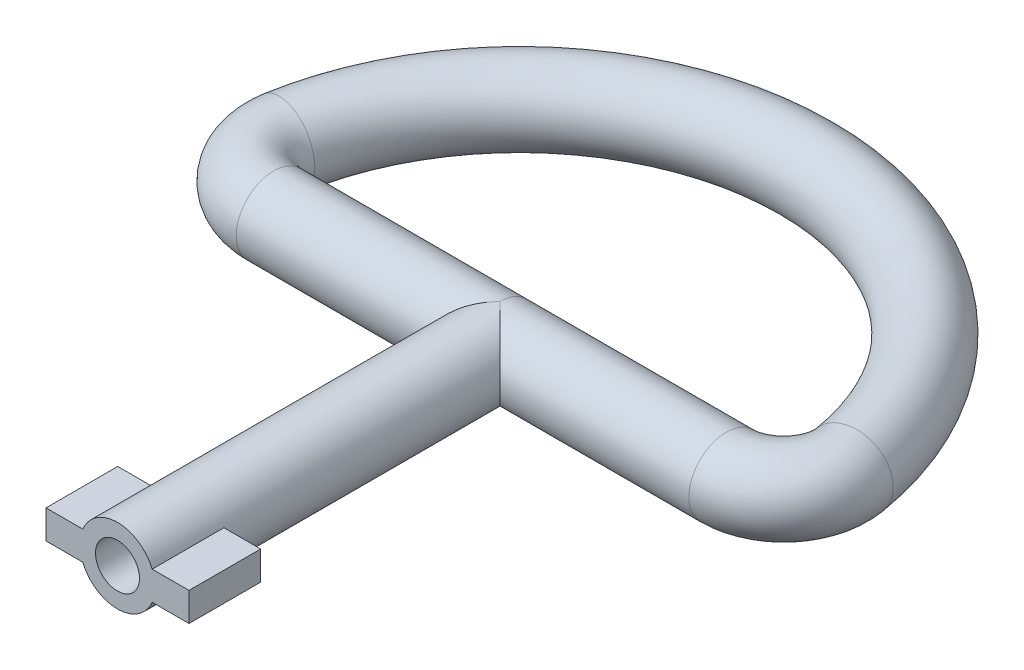
ISO-10303-21;
HEADER;
FILE_DESCRIPTION(('STEP AP214'),'2;1');
FILE_NAME('part.step','',(''),(''),'','','');
FILE_SCHEMA(('AUTOMOTIVE_DESIGN { 1 0 10303 214 1 1 1 1 }'));
ENDSEC;
DATA;
#1=APPLICATION_CONTEXT('core data for automotive mechanical design processes');
#2=APPLICATION_PROTOCOL_DEFINITION('international standard','automotive_design',2000,#1);
#3=PRODUCT_CONTEXT('',#1,'mechanical');
#4=PRODUCT('Part','Part','',(#3));
#5=PRODUCT_RELATED_PRODUCT_CATEGORY('part','',(#4));
#6=PRODUCT_DEFINITION_FORMATION('','',#4);
#7=PRODUCT_DEFINITION_CONTEXT('part definition',#1,'design');
#8=PRODUCT_DEFINITION('design','',#6,#7);
#9=PRODUCT_DEFINITION_SHAPE('','',#8);
#10=(LENGTH_UNIT() NAMED_UNIT(*) SI_UNIT(.MILLI.,.METRE.));
#11=(NAMED_UNIT(*) PLANE_ANGLE_UNIT() SI_UNIT($,.RADIAN.));
#12=(NAMED_UNIT(*) SI_UNIT($,.STERADIAN.) SOLID_ANGLE_UNIT());
#13=UNCERTAINTY_MEASURE_WITH_UNIT(LENGTH_MEASURE(1.E-05),#10,'distance_accuracy_value','');
#14=(GEOMETRIC_REPRESENTATION_CONTEXT(3) GLOBAL_UNCERTAINTY_ASSIGNED_CONTEXT((#13)) GLOBAL_UNIT_ASSIGNED_CONTEXT((#10,
#11,#12)) REPRESENTATION_CONTEXT('',''));
#15=CARTESIAN_POINT('',(0.,0.,0.));
#16=DIRECTION('',(0.,0.,1.));
#17=DIRECTION('',(1.,0.,0.));
#18=AXIS2_PLACEMENT_3D('',#15,#16,#17);
#19=CARTESIAN_POINT('',(0.,0.,-7.5));
#20=DIRECTION('',(0.,0.,1.));
#21=DIRECTION('',(1.,0.,0.));
#22=AXIS2_PLACEMENT_3D('',#19,#20,#21);
#23=CYLINDRICAL_SURFACE('',#22,3.925);
#24=CARTESIAN_POINT('',(0.,0.,0.));
#25=DIRECTION('',(0.,0.,1.));
#26=DIRECTION('',(1.,0.,0.));
#27=AXIS2_PLACEMENT_3D('',#24,#25,#26);
#28=CIRCLE('',#27,3.925);
#29=CARTESIAN_POINT('',(-3.62706837542388,-1.5,0.));
#30=VERTEX_POINT('',#29);
#31=CARTESIAN_POINT('',(3.62706837542388,-1.5,0.));
#32=VERTEX_POINT('',#31);
#33=EDGE_CURVE('E172',#30,#32,#28,.T.);
#34=ORIENTED_EDGE('',*,*,#33,.F.);
#35=DIRECTION('',(0.,0.,1.));
#36=VECTOR('',#35,1.);
#37=CARTESIAN_POINT('',(-3.62706837542388,-1.5,-7.5));
#38=LINE('',#37,#36);
#39=CARTESIAN_POINT('',(-3.62706837542388,-1.5,-7.5));
#40=VERTEX_POINT('',#39);
#41=EDGE_CURVE('E192',#40,#30,#38,.T.);
#42=ORIENTED_EDGE('',*,*,#41,.F.);
#43=CARTESIAN_POINT('',(0.,0.,-7.5));
#44=DIRECTION('',(0.,0.,-1.));
#45=DIRECTION('',(-1.,0.,0.));
#46=AXIS2_PLACEMENT_3D('',#43,#44,#45);
#47=CIRCLE('',#46,3.925);
#48=CARTESIAN_POINT('',(-3.62706837542388,1.5,-7.5));
#49=VERTEX_POINT('',#48);
#50=EDGE_CURVE('E52',#40,#49,#47,.T.);
#51=ORIENTED_EDGE('',*,*,#50,.T.);
#52=DIRECTION('',(0.,0.,1.));
#53=VECTOR('',#52,1.);
#54=CARTESIAN_POINT('',(-3.62706837542388,1.5,-7.5));
#55=LINE('',#54,#53);
#56=CARTESIAN_POINT('',(-3.62706837542388,1.5,0.));
#57=VERTEX_POINT('',#56);
#58=EDGE_CURVE('E46',#49,#57,#55,.T.);
#59=ORIENTED_EDGE('',*,*,#58,.T.);
#60=CARTESIAN_POINT('',(0.,0.,0.));
#61=DIRECTION('',(0.,0.,1.));
#62=DIRECTION('',(1.,0.,0.));
#63=AXIS2_PLACEMENT_3D('',#60,#61,#62);
#64=CIRCLE('',#63,3.925);
#65=CARTESIAN_POINT('',(3.62706837542388,1.5,0.));
#66=VERTEX_POINT('',#65);
#67=EDGE_CURVE('E155',#66,#57,#64,.T.);
#68=ORIENTED_EDGE('',*,*,#67,.F.);
#69=DIRECTION('',(0.,0.,1.));
#70=VECTOR('',#69,1.);
#71=CARTESIAN_POINT('',(3.62706837542388,1.5,-7.5));
#72=LINE('',#71,#70);
#73=CARTESIAN_POINT('',(3.62706837542388,1.5,-7.5));
#74=VERTEX_POINT('',#73);
#75=EDGE_CURVE('E100',#74,#66,#72,.T.);
#76=ORIENTED_EDGE('',*,*,#75,.F.);
#77=CARTESIAN_POINT('',(3.62706837542388,-1.5,-7.5));
#78=VERTEX_POINT('',#77);
#79=EDGE_CURVE('E11',#74,#78,#47,.T.);
#80=ORIENTED_EDGE('',*,*,#79,.T.);
#81=DIRECTION('',(0.,0.,1.));
#82=VECTOR('',#81,1.);
#83=CARTESIAN_POINT('',(3.62706837542388,-1.5,-7.5));
#84=LINE('',#83,#82);
#85=EDGE_CURVE('E136',#78,#32,#84,.T.);
#86=ORIENTED_EDGE('',*,*,#85,.T.);
#87=EDGE_LOOP('',(#34,#42,#51,#59,#68,#76,#80,#86));
#88=FACE_BOUND('',#87,.T.);
#89=CARTESIAN_POINT('',(0.,0.,-40.));
#90=DIRECTION('',(-0.707106781186547,0.,0.707106781186547));
#91=DIRECTION('',(0.707106781186547,0.,0.707106781186547));
#92=AXIS2_PLACEMENT_3D('',#89,#90,#91);
#93=ELLIPSE('',#92,5.55078823231439,3.925);
#94=CARTESIAN_POINT('',(0.,-3.925,-40.));
#95=VERTEX_POINT('',#94);
#96=CARTESIAN_POINT('',(0.,3.925,-40.));
#97=VERTEX_POINT('',#96);
#98=EDGE_CURVE('E254',#95,#97,#93,.T.);
#99=ORIENTED_EDGE('',*,*,#98,.T.);
#100=CARTESIAN_POINT('',(0.,0.,-40.));
#101=DIRECTION('',(0.707106781186547,0.,0.707106781186547));
#102=DIRECTION('',(-0.707106781186547,0.,0.707106781186547));
#103=AXIS2_PLACEMENT_3D('',#100,#101,#102);
#104=ELLIPSE('',#103,5.55078823231439,3.925);
#105=EDGE_CURVE('E247',#97,#95,#104,.T.);
#106=ORIENTED_EDGE('',*,*,#105,.T.);
#107=EDGE_LOOP('',(#99,#106));
#108=FACE_BOUND('',#107,.T.);
#109=ADVANCED_FACE('F42',(#88,#108),#23,.T.);
#110=CARTESIAN_POINT('',(0.,0.,-7.5));
#111=DIRECTION('',(0.,0.,1.));
#112=DIRECTION('',(1.,0.,0.));
#113=AXIS2_PLACEMENT_3D('',#110,#111,#112);
#114=PLANE('',#113);
#115=ORIENTED_EDGE('',*,*,#79,.F.);
#116=DIRECTION('',(-1.,0.,0.));
#117=VECTOR('',#116,1.);
#118=CARTESIAN_POINT('',(3.62706837542388,1.5,-7.5));
#119=LINE('',#118,#117);
#120=CARTESIAN_POINT('',(7.475,1.5,-7.5));
#121=VERTEX_POINT('',#120);
#122=EDGE_CURVE('E140',#121,#74,#119,.T.);
#123=ORIENTED_EDGE('',*,*,#122,.F.);
#124=DIRECTION('',(0.,1.,0.));
#125=VECTOR('',#124,1.);
#126=CARTESIAN_POINT('',(7.475,1.5,-7.5));
#127=LINE('',#126,#125);
#128=CARTESIAN_POINT('',(7.475,-1.5,-7.5));
#129=VERTEX_POINT('',#128);
#130=EDGE_CURVE('E127',#129,#121,#127,.T.);
#131=ORIENTED_EDGE('',*,*,#130,.F.);
#132=DIRECTION('',(1.,0.,0.));
#133=VECTOR('',#132,1.);
#134=CARTESIAN_POINT('',(7.475,-1.5,-7.5));
#135=LINE('',#134,#133);
#136=EDGE_CURVE('E139',#78,#129,#135,.T.);
#137=ORIENTED_EDGE('',*,*,#136,.F.);
#138=EDGE_LOOP('',(#115,#123,#131,#137));
#139=FACE_BOUND('',#138,.T.);
#140=ADVANCED_FACE('F138',(#139),#114,.F.);
#141=CARTESIAN_POINT('',(3.62706837542388,1.5,-7.5));
#142=DIRECTION('',(0.,1.,0.));
#143=DIRECTION('',(-1.,0.,0.));
#144=AXIS2_PLACEMENT_3D('',#141,#142,#143);
#145=PLANE('',#144);
#146=DIRECTION('',(-1.,0.,0.));
#147=VECTOR('',#146,1.);
#148=CARTESIAN_POINT('',(3.62706837542388,1.5,0.));
#149=LINE('',#148,#147);
#150=CARTESIAN_POINT('',(7.475,1.5,0.));
#151=VERTEX_POINT('',#150);
#152=EDGE_CURVE('E181',#151,#66,#149,.T.);
#153=ORIENTED_EDGE('',*,*,#152,.F.);
#154=DIRECTION('',(0.,0.,1.));
#155=VECTOR('',#154,1.);
#156=CARTESIAN_POINT('',(7.475,1.5,-7.5));
#157=LINE('',#156,#155);
#158=EDGE_CURVE('E135',#121,#151,#157,.T.);
#159=ORIENTED_EDGE('',*,*,#158,.F.);
#160=ORIENTED_EDGE('',*,*,#122,.T.);
#161=ORIENTED_EDGE('',*,*,#75,.T.);
#162=EDGE_LOOP('',(#153,#159,#160,#161));
#163=FACE_BOUND('',#162,.T.);
#164=ADVANCED_FACE('F210',(#163),#145,.T.);
#165=CARTESIAN_POINT('',(7.475,1.5,-7.5));
#166=DIRECTION('',(1.,0.,0.));
#167=DIRECTION('',(0.,0.,-1.));
#168=AXIS2_PLACEMENT_3D('',#165,#166,#167);
#169=PLANE('',#168);
#170=DIRECTION('',(0.,1.,0.));
#171=VECTOR('',#170,1.);
#172=CARTESIAN_POINT('',(7.475,1.5,0.));
#173=LINE('',#172,#171);
#174=CARTESIAN_POINT('',(7.475,-1.5,0.));
#175=VERTEX_POINT('',#174);
#176=EDGE_CURVE('E129',#175,#151,#173,.T.);
#177=ORIENTED_EDGE('',*,*,#176,.F.);
#178=DIRECTION('',(0.,0.,1.));
#179=VECTOR('',#178,1.);
#180=CARTESIAN_POINT('',(7.475,-1.5,-7.5));
#181=LINE('',#180,#179);
#182=EDGE_CURVE('E124',#129,#175,#181,.T.);
#183=ORIENTED_EDGE('',*,*,#182,.F.);
#184=ORIENTED_EDGE('',*,*,#130,.T.);
#185=ORIENTED_EDGE('',*,*,#158,.T.);
#186=EDGE_LOOP('',(#177,#183,#184,#185));
#187=FACE_BOUND('',#186,.T.);
#188=ADVANCED_FACE('F126',(#187),#169,.T.);
#189=CARTESIAN_POINT('',(7.475,-1.5,-7.5));
#190=DIRECTION('',(0.,-1.,0.));
#191=DIRECTION('',(1.,0.,0.));
#192=AXIS2_PLACEMENT_3D('',#189,#190,#191);
#193=PLANE('',#192);
#194=DIRECTION('',(1.,0.,0.));
#195=VECTOR('',#194,1.);
#196=CARTESIAN_POINT('',(7.475,-1.5,0.));
#197=LINE('',#196,#195);
#198=EDGE_CURVE('E176',#32,#175,#197,.T.);
#199=ORIENTED_EDGE('',*,*,#198,.F.);
#200=ORIENTED_EDGE('',*,*,#85,.F.);
#201=ORIENTED_EDGE('',*,*,#136,.T.);
#202=ORIENTED_EDGE('',*,*,#182,.T.);
#203=EDGE_LOOP('',(#199,#200,#201,#202));
#204=FACE_BOUND('',#203,.T.);
#205=ADVANCED_FACE('F143',(#204),#193,.T.);
#206=CARTESIAN_POINT('',(-7.475,-1.5,-7.5));
#207=DIRECTION('',(0.,-1.,0.));
#208=DIRECTION('',(1.,0.,0.));
#209=AXIS2_PLACEMENT_3D('',#206,#207,#208);
#210=PLANE('',#209);
#211=DIRECTION('',(1.,0.,0.));
#212=VECTOR('',#211,1.);
#213=CARTESIAN_POINT('',(-7.475,-1.5,0.));
#214=LINE('',#213,#212);
#215=CARTESIAN_POINT('',(-7.475,-1.5,0.));
#216=VERTEX_POINT('',#215);
#217=EDGE_CURVE('E168',#216,#30,#214,.T.);
#218=ORIENTED_EDGE('',*,*,#217,.F.);
#219=DIRECTION('',(0.,0.,1.));
#220=VECTOR('',#219,1.);
#221=CARTESIAN_POINT('',(-7.475,-1.5,-7.5));
#222=LINE('',#221,#220);
#223=CARTESIAN_POINT('',(-7.475,-1.5,-7.5));
#224=VERTEX_POINT('',#223);
#225=EDGE_CURVE('E195',#224,#216,#222,.T.);
#226=ORIENTED_EDGE('',*,*,#225,.F.);
#227=DIRECTION('',(1.,0.,0.));
#228=VECTOR('',#227,1.);
#229=CARTESIAN_POINT('',(-7.475,-1.5,-7.5));
#230=LINE('',#229,#228);
#231=EDGE_CURVE('E145',#224,#40,#230,.T.);
#232=ORIENTED_EDGE('',*,*,#231,.T.);
#233=ORIENTED_EDGE('',*,*,#41,.T.);
#234=EDGE_LOOP('',(#218,#226,#232,#233));
#235=FACE_BOUND('',#234,.T.);
#236=ADVANCED_FACE('F227',(#235),#210,.T.);
#237=CARTESIAN_POINT('',(-7.475,1.5,-7.5));
#238=DIRECTION('',(-1.,0.,0.));
#239=DIRECTION('',(0.,0.,1.));
#240=AXIS2_PLACEMENT_3D('',#237,#238,#239);
#241=PLANE('',#240);
#242=DIRECTION('',(0.,-1.,0.));
#243=VECTOR('',#242,1.);
#244=CARTESIAN_POINT('',(-7.475,1.5,0.));
#245=LINE('',#244,#243);
#246=CARTESIAN_POINT('',(-7.475,1.5,0.));
#247=VERTEX_POINT('',#246);
#248=EDGE_CURVE('E164',#247,#216,#245,.T.);
#249=ORIENTED_EDGE('',*,*,#248,.F.);
#250=DIRECTION('',(0.,0.,1.));
#251=VECTOR('',#250,1.);
#252=CARTESIAN_POINT('',(-7.475,1.5,-7.5));
#253=LINE('',#252,#251);
#254=CARTESIAN_POINT('',(-7.475,1.5,-7.5));
#255=VERTEX_POINT('',#254);
#256=EDGE_CURVE('E108',#255,#247,#253,.T.);
#257=ORIENTED_EDGE('',*,*,#256,.F.);
#258=DIRECTION('',(0.,-1.,0.));
#259=VECTOR('',#258,1.);
#260=CARTESIAN_POINT('',(-7.475,1.5,-7.5));
#261=LINE('',#260,#259);
#262=EDGE_CURVE('E149',#255,#224,#261,.T.);
#263=ORIENTED_EDGE('',*,*,#262,.T.);
#264=ORIENTED_EDGE('',*,*,#225,.T.);
#265=EDGE_LOOP('',(#249,#257,#263,#264));
#266=FACE_BOUND('',#265,.T.);
#267=ADVANCED_FACE('F229',(#266),#241,.T.);
#268=CARTESIAN_POINT('',(-3.62706837542388,1.5,-7.5));
#269=DIRECTION('',(0.,1.,0.));
#270=DIRECTION('',(-1.,0.,0.));
#271=AXIS2_PLACEMENT_3D('',#268,#269,#270);
#272=PLANE('',#271);
#273=DIRECTION('',(-1.,0.,0.));
#274=VECTOR('',#273,1.);
#275=CARTESIAN_POINT('',(-3.62706837542388,1.5,0.));
#276=LINE('',#275,#274);
#277=EDGE_CURVE('E159',#57,#247,#276,.T.);
#278=ORIENTED_EDGE('',*,*,#277,.F.);
#279=ORIENTED_EDGE('',*,*,#58,.F.);
#280=DIRECTION('',(-1.,0.,0.));
#281=VECTOR('',#280,1.);
#282=CARTESIAN_POINT('',(-3.62706837542388,1.5,-7.5));
#283=LINE('',#282,#281);
#284=EDGE_CURVE('E185',#49,#255,#283,.T.);
#285=ORIENTED_EDGE('',*,*,#284,.T.);
#286=ORIENTED_EDGE('',*,*,#256,.T.);
#287=EDGE_LOOP('',(#278,#279,#285,#286));
#288=FACE_BOUND('',#287,.T.);
#289=ADVANCED_FACE('F44',(#288),#272,.T.);
#290=ORIENTED_EDGE('',*,*,#50,.F.);
#291=ORIENTED_EDGE('',*,*,#231,.F.);
#292=ORIENTED_EDGE('',*,*,#262,.F.);
#293=ORIENTED_EDGE('',*,*,#284,.F.);
#294=EDGE_LOOP('',(#290,#291,#292,#293));
#295=FACE_BOUND('',#294,.T.);
#296=ADVANCED_FACE('F219',(#295),#114,.F.);
#297=CARTESIAN_POINT('',(0.,0.,0.));
#298=DIRECTION('',(0.,0.,1.));
#299=DIRECTION('',(1.,0.,0.));
#300=AXIS2_PLACEMENT_3D('',#297,#298,#299);
#301=PLANE('',#300);
#302=CARTESIAN_POINT('',(0.,0.,0.));
#303=DIRECTION('',(0.,0.,1.));
#304=DIRECTION('',(1.,0.,0.));
#305=AXIS2_PLACEMENT_3D('',#302,#303,#304);
#306=CIRCLE('',#305,2.3);
#307=CARTESIAN_POINT('',(2.3,0.,0.));
#308=VERTEX_POINT('',#307);
#309=EDGE_CURVE('E243',#308,#308,#306,.T.);
#310=ORIENTED_EDGE('',*,*,#309,.F.);
#311=EDGE_LOOP('',(#310));
#312=FACE_BOUND('',#311,.T.);
#313=ORIENTED_EDGE('',*,*,#67,.T.);
#314=ORIENTED_EDGE('',*,*,#277,.T.);
#315=ORIENTED_EDGE('',*,*,#248,.T.);
#316=ORIENTED_EDGE('',*,*,#217,.T.);
#317=ORIENTED_EDGE('',*,*,#33,.T.);
#318=ORIENTED_EDGE('',*,*,#198,.T.);
#319=ORIENTED_EDGE('',*,*,#176,.T.);
#320=ORIENTED_EDGE('',*,*,#152,.T.);
#321=EDGE_LOOP('',(#313,#314,#315,#316,#317,#318,#319,#320));
#322=FACE_BOUND('',#321,.T.);
#323=ADVANCED_FACE('F209',(#312,#322),#301,.T.);
#324=CARTESIAN_POINT('',(0.,0.,-7.5));
#325=DIRECTION('',(0.,0.,1.));
#326=DIRECTION('',(1.,0.,0.));
#327=AXIS2_PLACEMENT_3D('',#324,#325,#326);
#328=CYLINDRICAL_SURFACE('',#327,2.3);
#329=CARTESIAN_POINT('',(0.,0.,-7.5));
#330=DIRECTION('',(0.,0.,1.));
#331=DIRECTION('',(1.,0.,0.));
#332=AXIS2_PLACEMENT_3D('',#329,#330,#331);
#333=CIRCLE('',#332,2.3);
#334=CARTESIAN_POINT('',(2.3,0.,-7.5));
#335=VERTEX_POINT('',#334);
#336=EDGE_CURVE('E160',#335,#335,#333,.T.);
#337=ORIENTED_EDGE('',*,*,#336,.F.);
#338=EDGE_LOOP('',(#337));
#339=FACE_BOUND('',#338,.T.);
#340=ORIENTED_EDGE('',*,*,#309,.T.);
#341=EDGE_LOOP('',(#340));
#342=FACE_BOUND('',#341,.T.);
#343=ADVANCED_FACE('F303',(#339,#342),#328,.F.);
#344=CARTESIAN_POINT('',(0.,0.,-7.5));
#345=DIRECTION('',(0.,0.,-1.));
#346=DIRECTION('',(-1.,0.,0.));
#347=AXIS2_PLACEMENT_3D('',#344,#345,#346);
#348=PLANE('',#347);
#349=ORIENTED_EDGE('',*,*,#336,.T.);
#350=EDGE_LOOP('',(#349));
#351=FACE_BOUND('',#350,.T.);
#352=ADVANCED_FACE('F291',(#351),#348,.F.);
#353=CARTESIAN_POINT('',(0.,0.,-40.));
#354=DIRECTION('',(-1.,0.,0.));
#355=DIRECTION('',(0.,0.,1.));
#356=AXIS2_PLACEMENT_3D('',#353,#354,#355);
#357=CYLINDRICAL_SURFACE('',#356,3.925);
#358=ORIENTED_EDGE('',*,*,#105,.F.);
#359=CARTESIAN_POINT('',(0.,0.,-40.));
#360=DIRECTION('',(1.,0.,0.));
#361=DIRECTION('',(0.,0.,-1.));
#362=AXIS2_PLACEMENT_3D('',#359,#360,#361);
#363=CIRCLE('',#362,3.925);
#364=EDGE_CURVE('E59',#95,#97,#363,.T.);
#365=ORIENTED_EDGE('',*,*,#364,.F.);
#366=EDGE_LOOP('',(#358,#365));
#367=FACE_BOUND('',#366,.T.);
#368=CARTESIAN_POINT('',(-23.6643191323986,0.,-40.));
#369=DIRECTION('',(1.,0.,0.));
#370=DIRECTION('',(0.,0.,-1.));
#371=AXIS2_PLACEMENT_3D('',#368,#369,#370);
#372=CIRCLE('',#371,3.925);
#373=CARTESIAN_POINT('',(-23.6643191323986,0.,-36.0750000000001));
#374=VERTEX_POINT('',#373);
#375=EDGE_CURVE('E270',#374,#374,#372,.T.);
#376=ORIENTED_EDGE('',*,*,#375,.T.);
#377=EDGE_LOOP('',(#376));
#378=FACE_BOUND('',#377,.T.);
#379=ADVANCED_FACE('F277',(#367,#378),#357,.T.);
#380=CARTESIAN_POINT('',(-23.6643191323986,0.,-46.));
#381=DIRECTION('',(0.,-1.,0.));
#382=DIRECTION('',(0.,0.,-1.));
#383=AXIS2_PLACEMENT_3D('',#380,#381,#382);
#384=TOROIDAL_SURFACE('',#383,5.99999999999994,3.925);
#385=CARTESIAN_POINT('',(-29.5803989154981,0.,-47.));
#386=DIRECTION('',(-0.166666666666666,0.,0.986013297183269));
#387=DIRECTION('',(0.986013297183269,0.,0.166666666666666));
#388=AXIS2_PLACEMENT_3D('',#385,#386,#387);
#389=CIRCLE('',#388,3.925);
#390=CARTESIAN_POINT('',(-33.4505011069424,0.,-47.6541666666667));
#391=VERTEX_POINT('',#390);
#392=EDGE_CURVE('E266',#391,#391,#389,.T.);
#393=CARTESIAN_POINT('',(-23.6643191323986,0.,-46.));
#394=DIRECTION('',(0.,-1.,0.));
#395=DIRECTION('',(0.,0.,-1.));
#396=AXIS2_PLACEMENT_3D('',#393,#394,#395);
#397=CIRCLE('',#396,9.92499999999993);
#398=EDGE_CURVE('',#374,#391,#397,.T.);
#399=ORIENTED_EDGE('',*,*,#375,.F.);
#400=ORIENTED_EDGE('',*,*,#392,.T.);
#401=ORIENTED_EDGE('',*,*,#398,.T.);
#402=ORIENTED_EDGE('',*,*,#398,.F.);
#403=EDGE_LOOP('',(#399,#401,#400,#402));
#404=FACE_BOUND('',#403,.T.);
#405=ADVANCED_FACE('F279',(#404),#384,.T.);
#406=CARTESIAN_POINT('',(0.,0.,-42.));
#407=DIRECTION('',(0.,-1.,0.));
#408=DIRECTION('',(0.,0.,-1.));
#409=AXIS2_PLACEMENT_3D('',#406,#407,#408);
#410=TOROIDAL_SURFACE('',#409,30.,3.925);
#411=CARTESIAN_POINT('',(29.580398915498,0.,-47.));
#412=DIRECTION('',(-0.166666666666666,0.,-0.986013297183269));
#413=DIRECTION('',(-0.986013297183269,0.,0.166666666666666));
#414=AXIS2_PLACEMENT_3D('',#411,#412,#413);
#415=CIRCLE('',#414,3.925);
#416=CARTESIAN_POINT('',(33.4505011069424,0.,-47.6541666666666));
#417=VERTEX_POINT('',#416);
#418=EDGE_CURVE('E262',#417,#417,#415,.T.);
#419=CARTESIAN_POINT('',(0.,0.,-42.));
#420=DIRECTION('',(0.,-1.,0.));
#421=DIRECTION('',(0.,0.,-1.));
#422=AXIS2_PLACEMENT_3D('',#419,#420,#421);
#423=CIRCLE('',#422,33.925);
#424=EDGE_CURVE('',#391,#417,#423,.T.);
#425=ORIENTED_EDGE('',*,*,#392,.F.);
#426=ORIENTED_EDGE('',*,*,#418,.T.);
#427=ORIENTED_EDGE('',*,*,#424,.T.);
#428=ORIENTED_EDGE('',*,*,#424,.F.);
#429=EDGE_LOOP('',(#425,#427,#426,#428));
#430=FACE_BOUND('',#429,.T.);
#431=ADVANCED_FACE('F281',(#430),#410,.T.);
#432=CARTESIAN_POINT('',(23.6643191323986,0.,-46.));
#433=DIRECTION('',(0.,-1.,0.));
#434=DIRECTION('',(0.,0.,-1.));
#435=AXIS2_PLACEMENT_3D('',#432,#433,#434);
#436=TOROIDAL_SURFACE('',#435,5.99999999999994,3.925);
#437=CARTESIAN_POINT('',(23.6643191323986,0.,-40.0000000000001));
#438=DIRECTION('',(1.,0.,0.));
#439=DIRECTION('',(0.,0.,-1.));
#440=AXIS2_PLACEMENT_3D('',#437,#438,#439);
#441=CIRCLE('',#440,3.925);
#442=CARTESIAN_POINT('',(23.6643191323986,0.,-36.0750000000001));
#443=VERTEX_POINT('',#442);
#444=EDGE_CURVE('E258',#443,#443,#441,.T.);
#445=CARTESIAN_POINT('',(23.6643191323986,0.,-46.));
#446=DIRECTION('',(0.,-1.,0.));
#447=DIRECTION('',(0.,0.,-1.));
#448=AXIS2_PLACEMENT_3D('',#445,#446,#447);
#449=CIRCLE('',#448,9.92499999999994);
#450=EDGE_CURVE('',#417,#443,#449,.T.);
#451=ORIENTED_EDGE('',*,*,#418,.F.);
#452=ORIENTED_EDGE('',*,*,#444,.T.);
#453=ORIENTED_EDGE('',*,*,#450,.T.);
#454=ORIENTED_EDGE('',*,*,#450,.F.);
#455=EDGE_LOOP('',(#451,#453,#452,#454));
#456=FACE_BOUND('',#455,.T.);
#457=ADVANCED_FACE('F288',(#456),#436,.T.);
#458=CARTESIAN_POINT('',(23.6643191323986,0.,-40.));
#459=DIRECTION('',(-1.,0.,0.));
#460=DIRECTION('',(0.,0.,1.));
#461=AXIS2_PLACEMENT_3D('',#458,#459,#460);
#462=CYLINDRICAL_SURFACE('',#461,3.925);
#463=ORIENTED_EDGE('',*,*,#98,.F.);
#464=ORIENTED_EDGE('',*,*,#364,.T.);
#465=EDGE_LOOP('',(#463,#464));
#466=FACE_BOUND('',#465,.T.);
#467=ORIENTED_EDGE('',*,*,#444,.F.);
#468=EDGE_LOOP('',(#467));
#469=FACE_BOUND('',#468,.T.);
#470=ADVANCED_FACE('F297',(#466,#469),#462,.T.);
#471=CLOSED_SHELL('',(#109,#140,#164,#188,#205,#236,#267,#289,#296,#323,#343,#352,#379,#405,
#431,#457,#470));
#472=MANIFOLD_SOLID_BREP('B2',#471);
#473=ADVANCED_BREP_SHAPE_REPRESENTATION('',(#18,#472),#14);
#474=SHAPE_DEFINITION_REPRESENTATION(#9,#473);
ENDSEC;
END-ISO-10303-21;
